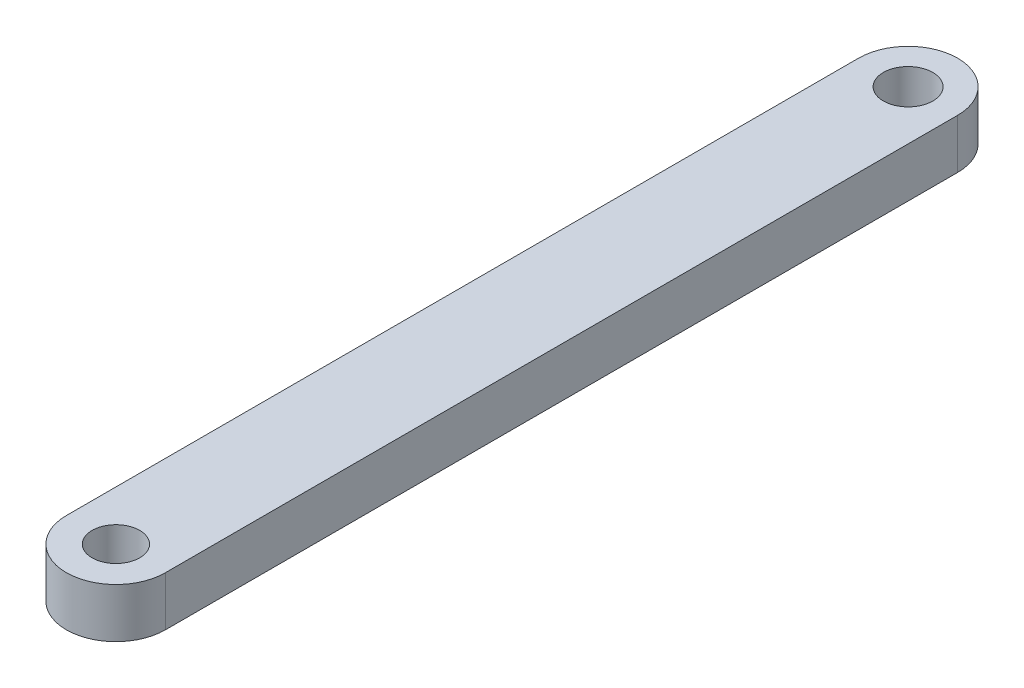
ISO-10303-21;
HEADER;
FILE_DESCRIPTION(('STEP AP214'),'2;1');
FILE_NAME('part.step','',(''),(''),'','','');
FILE_SCHEMA(('AUTOMOTIVE_DESIGN { 1 0 10303 214 1 1 1 1 }'));
ENDSEC;
DATA;
#1=APPLICATION_CONTEXT('core data for automotive mechanical design processes');
#2=APPLICATION_PROTOCOL_DEFINITION('international standard','automotive_design',2000,#1);
#3=PRODUCT_CONTEXT('',#1,'mechanical');
#4=PRODUCT('Part','Part','',(#3));
#5=PRODUCT_RELATED_PRODUCT_CATEGORY('part','',(#4));
#6=PRODUCT_DEFINITION_FORMATION('','',#4);
#7=PRODUCT_DEFINITION_CONTEXT('part definition',#1,'design');
#8=PRODUCT_DEFINITION('design','',#6,#7);
#9=PRODUCT_DEFINITION_SHAPE('','',#8);
#10=(LENGTH_UNIT() NAMED_UNIT(*) SI_UNIT(.MILLI.,.METRE.));
#11=(NAMED_UNIT(*) PLANE_ANGLE_UNIT() SI_UNIT($,.RADIAN.));
#12=(NAMED_UNIT(*) SI_UNIT($,.STERADIAN.) SOLID_ANGLE_UNIT());
#13=UNCERTAINTY_MEASURE_WITH_UNIT(LENGTH_MEASURE(1.E-05),#10,'distance_accuracy_value','');
#14=(GEOMETRIC_REPRESENTATION_CONTEXT(3) GLOBAL_UNCERTAINTY_ASSIGNED_CONTEXT((#13)) GLOBAL_UNIT_ASSIGNED_CONTEXT((#10,
#11,#12)) REPRESENTATION_CONTEXT('',''));
#15=CARTESIAN_POINT('',(0.,0.,0.));
#16=DIRECTION('',(0.,0.,1.));
#17=DIRECTION('',(1.,0.,0.));
#18=AXIS2_PLACEMENT_3D('',#15,#16,#17);
#19=CARTESIAN_POINT('',(0.,5.,-80.));
#20=DIRECTION('',(0.,-1.,0.));
#21=DIRECTION('',(0.,0.,-1.));
#22=AXIS2_PLACEMENT_3D('',#19,#20,#21);
#23=CYLINDRICAL_SURFACE('',#22,5.00000000000001);
#24=CARTESIAN_POINT('',(0.,0.,-80.));
#25=DIRECTION('',(0.,1.,0.));
#26=DIRECTION('',(0.,0.,1.));
#27=AXIS2_PLACEMENT_3D('',#24,#25,#26);
#28=CIRCLE('',#27,5.00000000000001);
#29=CARTESIAN_POINT('',(5.00000000000001,0.,-80.));
#30=VERTEX_POINT('',#29);
#31=CARTESIAN_POINT('',(-5.00000000000001,0.,-80.));
#32=VERTEX_POINT('',#31);
#33=EDGE_CURVE('E109',#30,#32,#28,.T.);
#34=ORIENTED_EDGE('',*,*,#33,.T.);
#35=DIRECTION('',(0.,-1.,0.));
#36=VECTOR('',#35,1.);
#37=CARTESIAN_POINT('',(-5.00000000000001,5.,-80.));
#38=LINE('',#37,#36);
#39=CARTESIAN_POINT('',(-5.00000000000001,5.,-80.));
#40=VERTEX_POINT('',#39);
#41=EDGE_CURVE('E11',#40,#32,#38,.T.);
#42=ORIENTED_EDGE('',*,*,#41,.F.);
#43=CARTESIAN_POINT('',(0.,5.,-80.));
#44=DIRECTION('',(0.,1.,0.));
#45=DIRECTION('',(0.,0.,1.));
#46=AXIS2_PLACEMENT_3D('',#43,#44,#45);
#47=CIRCLE('',#46,5.00000000000001);
#48=CARTESIAN_POINT('',(5.00000000000001,5.,-80.));
#49=VERTEX_POINT('',#48);
#50=EDGE_CURVE('E80',#49,#40,#47,.T.);
#51=ORIENTED_EDGE('',*,*,#50,.F.);
#52=DIRECTION('',(0.,-1.,0.));
#53=VECTOR('',#52,1.);
#54=CARTESIAN_POINT('',(5.00000000000001,5.,-80.));
#55=LINE('',#54,#53);
#56=EDGE_CURVE('E108',#49,#30,#55,.T.);
#57=ORIENTED_EDGE('',*,*,#56,.T.);
#58=EDGE_LOOP('',(#34,#42,#51,#57));
#59=FACE_BOUND('',#58,.T.);
#60=ADVANCED_FACE('F38',(#59),#23,.T.);
#61=CARTESIAN_POINT('',(-5.,5.,0.));
#62=DIRECTION('',(-1.,0.,0.));
#63=DIRECTION('',(0.,0.,1.));
#64=AXIS2_PLACEMENT_3D('',#61,#62,#63);
#65=PLANE('',#64);
#66=DIRECTION('',(0.,0.,-1.));
#67=VECTOR('',#66,1.);
#68=CARTESIAN_POINT('',(-5.,0.,0.));
#69=LINE('',#68,#67);
#70=CARTESIAN_POINT('',(-5.,0.,0.));
#71=VERTEX_POINT('',#70);
#72=EDGE_CURVE('E90',#71,#32,#69,.T.);
#73=ORIENTED_EDGE('',*,*,#72,.F.);
#74=DIRECTION('',(0.,-1.,0.));
#75=VECTOR('',#74,1.);
#76=CARTESIAN_POINT('',(-5.,5.,0.));
#77=LINE('',#76,#75);
#78=CARTESIAN_POINT('',(-5.,5.,0.));
#79=VERTEX_POINT('',#78);
#80=EDGE_CURVE('E46',#79,#71,#77,.T.);
#81=ORIENTED_EDGE('',*,*,#80,.F.);
#82=DIRECTION('',(0.,0.,-1.));
#83=VECTOR('',#82,1.);
#84=CARTESIAN_POINT('',(-5.,5.,0.));
#85=LINE('',#84,#83);
#86=EDGE_CURVE('E88',#79,#40,#85,.T.);
#87=ORIENTED_EDGE('',*,*,#86,.T.);
#88=ORIENTED_EDGE('',*,*,#41,.T.);
#89=EDGE_LOOP('',(#73,#81,#87,#88));
#90=FACE_BOUND('',#89,.T.);
#91=ADVANCED_FACE('F87',(#90),#65,.T.);
#92=CARTESIAN_POINT('',(0.,5.,0.));
#93=DIRECTION('',(0.,-1.,0.));
#94=DIRECTION('',(0.,0.,-1.));
#95=AXIS2_PLACEMENT_3D('',#92,#93,#94);
#96=CYLINDRICAL_SURFACE('',#95,5.);
#97=CARTESIAN_POINT('',(0.,0.,0.));
#98=DIRECTION('',(0.,1.,0.));
#99=DIRECTION('',(0.,0.,1.));
#100=AXIS2_PLACEMENT_3D('',#97,#98,#99);
#101=CIRCLE('',#100,5.);
#102=CARTESIAN_POINT('',(5.,0.,0.));
#103=VERTEX_POINT('',#102);
#104=EDGE_CURVE('E69',#71,#103,#101,.T.);
#105=ORIENTED_EDGE('',*,*,#104,.T.);
#106=DIRECTION('',(0.,-1.,0.));
#107=VECTOR('',#106,1.);
#108=CARTESIAN_POINT('',(5.,5.,0.));
#109=LINE('',#108,#107);
#110=CARTESIAN_POINT('',(5.,5.,0.));
#111=VERTEX_POINT('',#110);
#112=EDGE_CURVE('E91',#111,#103,#109,.T.);
#113=ORIENTED_EDGE('',*,*,#112,.F.);
#114=CARTESIAN_POINT('',(0.,5.,0.));
#115=DIRECTION('',(0.,1.,0.));
#116=DIRECTION('',(0.,0.,1.));
#117=AXIS2_PLACEMENT_3D('',#114,#115,#116);
#118=CIRCLE('',#117,5.);
#119=EDGE_CURVE('E92',#79,#111,#118,.T.);
#120=ORIENTED_EDGE('',*,*,#119,.F.);
#121=ORIENTED_EDGE('',*,*,#80,.T.);
#122=EDGE_LOOP('',(#105,#113,#120,#121));
#123=FACE_BOUND('',#122,.T.);
#124=ADVANCED_FACE('F93',(#123),#96,.T.);
#125=CARTESIAN_POINT('',(0.,5.,-80.));
#126=DIRECTION('',(0.,-1.,0.));
#127=DIRECTION('',(0.,0.,-1.));
#128=AXIS2_PLACEMENT_3D('',#125,#126,#127);
#129=CYLINDRICAL_SURFACE('',#128,2.5);
#130=CARTESIAN_POINT('',(0.,5.,-80.));
#131=DIRECTION('',(0.,1.,0.));
#132=DIRECTION('',(0.,0.,1.));
#133=AXIS2_PLACEMENT_3D('',#130,#131,#132);
#134=CIRCLE('',#133,2.5);
#135=CARTESIAN_POINT('',(0.,5.,-77.5));
#136=VERTEX_POINT('',#135);
#137=EDGE_CURVE('E102',#136,#136,#134,.T.);
#138=ORIENTED_EDGE('',*,*,#137,.T.);
#139=EDGE_LOOP('',(#138));
#140=FACE_BOUND('',#139,.T.);
#141=CARTESIAN_POINT('',(0.,0.,-80.));
#142=DIRECTION('',(0.,1.,0.));
#143=DIRECTION('',(0.,0.,1.));
#144=AXIS2_PLACEMENT_3D('',#141,#142,#143);
#145=CIRCLE('',#144,2.5);
#146=CARTESIAN_POINT('',(0.,0.,-77.5));
#147=VERTEX_POINT('',#146);
#148=EDGE_CURVE('E115',#147,#147,#145,.T.);
#149=ORIENTED_EDGE('',*,*,#148,.F.);
#150=EDGE_LOOP('',(#149));
#151=FACE_BOUND('',#150,.T.);
#152=ADVANCED_FACE('F134',(#140,#151),#129,.F.);
#153=CARTESIAN_POINT('',(5.,5.,0.));
#154=DIRECTION('',(-1.,0.,0.));
#155=DIRECTION('',(0.,0.,1.));
#156=AXIS2_PLACEMENT_3D('',#153,#154,#155);
#157=PLANE('',#156);
#158=DIRECTION('',(0.,0.,-1.));
#159=VECTOR('',#158,1.);
#160=CARTESIAN_POINT('',(5.,0.,0.));
#161=LINE('',#160,#159);
#162=EDGE_CURVE('E75',#103,#30,#161,.T.);
#163=ORIENTED_EDGE('',*,*,#162,.T.);
#164=ORIENTED_EDGE('',*,*,#56,.F.);
#165=DIRECTION('',(0.,0.,-1.));
#166=VECTOR('',#165,1.);
#167=CARTESIAN_POINT('',(5.,5.,0.));
#168=LINE('',#167,#166);
#169=EDGE_CURVE('E54',#111,#49,#168,.T.);
#170=ORIENTED_EDGE('',*,*,#169,.F.);
#171=ORIENTED_EDGE('',*,*,#112,.T.);
#172=EDGE_LOOP('',(#163,#164,#170,#171));
#173=FACE_BOUND('',#172,.T.);
#174=ADVANCED_FACE('F121',(#173),#157,.F.);
#175=CARTESIAN_POINT('',(0.,5.,0.));
#176=DIRECTION('',(0.,-1.,0.));
#177=DIRECTION('',(0.,0.,-1.));
#178=AXIS2_PLACEMENT_3D('',#175,#176,#177);
#179=CYLINDRICAL_SURFACE('',#178,2.40457411375231);
#180=CARTESIAN_POINT('',(0.,5.,0.));
#181=DIRECTION('',(0.,1.,0.));
#182=DIRECTION('',(0.,0.,1.));
#183=AXIS2_PLACEMENT_3D('',#180,#181,#182);
#184=CIRCLE('',#183,2.40457411375231);
#185=CARTESIAN_POINT('',(0.,5.,2.40457411375231));
#186=VERTEX_POINT('',#185);
#187=EDGE_CURVE('E105',#186,#186,#184,.T.);
#188=ORIENTED_EDGE('',*,*,#187,.T.);
#189=EDGE_LOOP('',(#188));
#190=FACE_BOUND('',#189,.T.);
#191=CARTESIAN_POINT('',(0.,0.,0.));
#192=DIRECTION('',(0.,1.,0.));
#193=DIRECTION('',(0.,0.,1.));
#194=AXIS2_PLACEMENT_3D('',#191,#192,#193);
#195=CIRCLE('',#194,2.40457411375231);
#196=CARTESIAN_POINT('',(0.,0.,2.40457411375231));
#197=VERTEX_POINT('',#196);
#198=EDGE_CURVE('E98',#197,#197,#195,.T.);
#199=ORIENTED_EDGE('',*,*,#198,.F.);
#200=EDGE_LOOP('',(#199));
#201=FACE_BOUND('',#200,.T.);
#202=ADVANCED_FACE('F139',(#190,#201),#179,.F.);
#203=CARTESIAN_POINT('',(0.,5.,0.));
#204=DIRECTION('',(0.,1.,0.));
#205=DIRECTION('',(0.,0.,1.));
#206=AXIS2_PLACEMENT_3D('',#203,#204,#205);
#207=PLANE('',#206);
#208=ORIENTED_EDGE('',*,*,#50,.T.);
#209=ORIENTED_EDGE('',*,*,#86,.F.);
#210=ORIENTED_EDGE('',*,*,#119,.T.);
#211=ORIENTED_EDGE('',*,*,#169,.T.);
#212=EDGE_LOOP('',(#208,#209,#210,#211));
#213=FACE_BOUND('',#212,.T.);
#214=ORIENTED_EDGE('',*,*,#137,.F.);
#215=EDGE_LOOP('',(#214));
#216=FACE_BOUND('',#215,.T.);
#217=ORIENTED_EDGE('',*,*,#187,.F.);
#218=EDGE_LOOP('',(#217));
#219=FACE_BOUND('',#218,.T.);
#220=ADVANCED_FACE('F95',(#213,#216,#219),#207,.T.);
#221=CARTESIAN_POINT('',(0.,0.,0.));
#222=DIRECTION('',(0.,1.,0.));
#223=DIRECTION('',(0.,0.,1.));
#224=AXIS2_PLACEMENT_3D('',#221,#222,#223);
#225=PLANE('',#224);
#226=ORIENTED_EDGE('',*,*,#33,.F.);
#227=ORIENTED_EDGE('',*,*,#162,.F.);
#228=ORIENTED_EDGE('',*,*,#104,.F.);
#229=ORIENTED_EDGE('',*,*,#72,.T.);
#230=EDGE_LOOP('',(#226,#227,#228,#229));
#231=FACE_BOUND('',#230,.T.);
#232=ORIENTED_EDGE('',*,*,#148,.T.);
#233=EDGE_LOOP('',(#232));
#234=FACE_BOUND('',#233,.T.);
#235=ORIENTED_EDGE('',*,*,#198,.T.);
#236=EDGE_LOOP('',(#235));
#237=FACE_BOUND('',#236,.T.);
#238=ADVANCED_FACE('F124',(#231,#234,#237),#225,.F.);
#239=CLOSED_SHELL('',(#60,#91,#124,#152,#174,#202,#220,#238));
#240=MANIFOLD_SOLID_BREP('B2',#239);
#241=ADVANCED_BREP_SHAPE_REPRESENTATION('',(#18,#240),#14);
#242=SHAPE_DEFINITION_REPRESENTATION(#9,#241);
ENDSEC;
END-ISO-10303-21;
